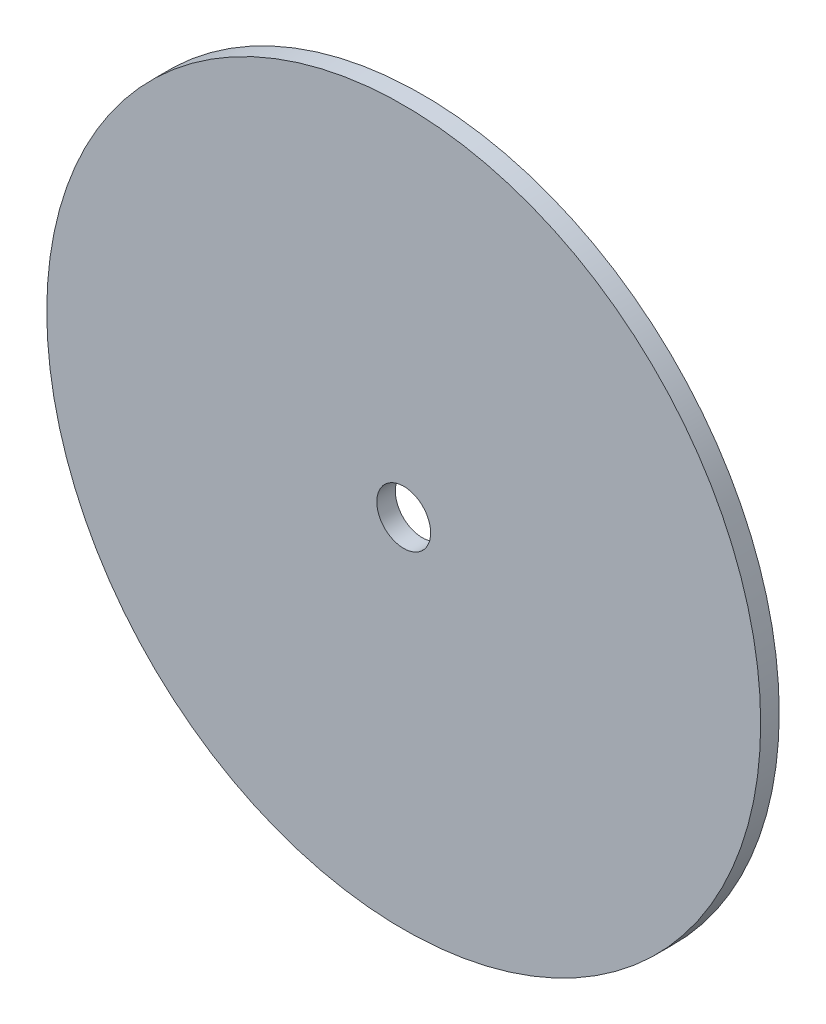
ISO-10303-21;
HEADER;
FILE_DESCRIPTION(('STEP AP214'),'2;1');
FILE_NAME('part.step','',(''),(''),'','','');
FILE_SCHEMA(('AUTOMOTIVE_DESIGN { 1 0 10303 214 1 1 1 1 }'));
ENDSEC;
DATA;
#1=APPLICATION_CONTEXT('core data for automotive mechanical design processes');
#2=APPLICATION_PROTOCOL_DEFINITION('international standard','automotive_design',2000,#1);
#3=PRODUCT_CONTEXT('',#1,'mechanical');
#4=PRODUCT('Part','Part','',(#3));
#5=PRODUCT_RELATED_PRODUCT_CATEGORY('part','',(#4));
#6=PRODUCT_DEFINITION_FORMATION('','',#4);
#7=PRODUCT_DEFINITION_CONTEXT('part definition',#1,'design');
#8=PRODUCT_DEFINITION('design','',#6,#7);
#9=PRODUCT_DEFINITION_SHAPE('','',#8);
#10=(LENGTH_UNIT() NAMED_UNIT(*) SI_UNIT(.MILLI.,.METRE.));
#11=(NAMED_UNIT(*) PLANE_ANGLE_UNIT() SI_UNIT($,.RADIAN.));
#12=(NAMED_UNIT(*) SI_UNIT($,.STERADIAN.) SOLID_ANGLE_UNIT());
#13=UNCERTAINTY_MEASURE_WITH_UNIT(LENGTH_MEASURE(1.E-05),#10,'distance_accuracy_value','');
#14=(GEOMETRIC_REPRESENTATION_CONTEXT(3) GLOBAL_UNCERTAINTY_ASSIGNED_CONTEXT((#13)) GLOBAL_UNIT_ASSIGNED_CONTEXT((#10,
#11,#12)) REPRESENTATION_CONTEXT('',''));
#15=CARTESIAN_POINT('',(0.,0.,0.));
#16=DIRECTION('',(0.,0.,1.));
#17=DIRECTION('',(1.,0.,0.));
#18=AXIS2_PLACEMENT_3D('',#15,#16,#17);
#19=CARTESIAN_POINT('',(0.,0.,1.55));
#20=DIRECTION('',(0.,0.,-1.));
#21=DIRECTION('',(-1.,0.,0.));
#22=AXIS2_PLACEMENT_3D('',#19,#20,#21);
#23=CYLINDRICAL_SURFACE('',#22,59.655);
#24=CARTESIAN_POINT('',(0.,0.,1.55));
#25=DIRECTION('',(0.,0.,1.));
#26=DIRECTION('',(1.,0.,0.));
#27=AXIS2_PLACEMENT_3D('',#24,#25,#26);
#28=CIRCLE('',#27,59.655);
#29=CARTESIAN_POINT('',(-59.655,0.,1.55));
#30=VERTEX_POINT('',#29);
#31=EDGE_CURVE('E10',#30,#30,#28,.T.);
#32=CARTESIAN_POINT('',(0.,0.,-1.55));
#33=DIRECTION('',(0.,0.,1.));
#34=DIRECTION('',(1.,0.,0.));
#35=AXIS2_PLACEMENT_3D('',#32,#33,#34);
#36=CIRCLE('',#35,59.655);
#37=CARTESIAN_POINT('',(-59.655,0.,-1.55));
#38=VERTEX_POINT('',#37);
#39=EDGE_CURVE('E42',#38,#38,#36,.T.);
#40=CARTESIAN_POINT('',(-59.655,0.,1.55));
#41=CARTESIAN_POINT('',(-59.655,0.,1.51770833333333));
#42=CARTESIAN_POINT('',(-59.655,0.,1.48541666666667));
#43=CARTESIAN_POINT('',(-59.655,0.,1.42083333333333));
#44=CARTESIAN_POINT('',(-59.655,0.,1.38854166666667));
#45=CARTESIAN_POINT('',(-59.655,0.,1.32395833333333));
#46=CARTESIAN_POINT('',(-59.655,0.,1.29166666666667));
#47=CARTESIAN_POINT('',(-59.655,0.,1.22708333333333));
#48=CARTESIAN_POINT('',(-59.655,0.,1.19479166666667));
#49=CARTESIAN_POINT('',(-59.655,0.,1.13020833333333));
#50=CARTESIAN_POINT('',(-59.655,0.,1.09791666666667));
#51=CARTESIAN_POINT('',(-59.655,0.,1.03333333333333));
#52=CARTESIAN_POINT('',(-59.655,0.,1.00104166666667));
#53=CARTESIAN_POINT('',(-59.655,0.,0.936458333333333));
#54=CARTESIAN_POINT('',(-59.655,0.,0.904166666666667));
#55=CARTESIAN_POINT('',(-59.655,0.,0.839583333333333));
#56=CARTESIAN_POINT('',(-59.655,0.,0.807291666666667));
#57=CARTESIAN_POINT('',(-59.655,0.,0.742708333333333));
#58=CARTESIAN_POINT('',(-59.655,0.,0.710416666666667));
#59=CARTESIAN_POINT('',(-59.655,0.,0.645833333333333));
#60=CARTESIAN_POINT('',(-59.655,0.,0.613541666666667));
#61=CARTESIAN_POINT('',(-59.655,0.,0.548958333333333));
#62=CARTESIAN_POINT('',(-59.655,0.,0.516666666666666));
#63=CARTESIAN_POINT('',(-59.655,0.,0.452083333333333));
#64=CARTESIAN_POINT('',(-59.655,0.,0.419791666666666));
#65=CARTESIAN_POINT('',(-59.655,0.,0.355208333333333));
#66=CARTESIAN_POINT('',(-59.655,0.,0.322916666666667));
#67=CARTESIAN_POINT('',(-59.655,0.,0.258333333333333));
#68=CARTESIAN_POINT('',(-59.655,0.,0.226041666666666));
#69=CARTESIAN_POINT('',(-59.655,0.,0.161458333333333));
#70=CARTESIAN_POINT('',(-59.655,0.,0.129166666666666));
#71=CARTESIAN_POINT('',(-59.655,0.,0.0645833333333331));
#72=CARTESIAN_POINT('',(-59.655,0.,0.0322916666666664));
#73=CARTESIAN_POINT('',(-59.655,0.,-0.0322916666666669));
#74=CARTESIAN_POINT('',(-59.655,0.,-0.0645833333333335));
#75=CARTESIAN_POINT('',(-59.655,0.,-0.129166666666667));
#76=CARTESIAN_POINT('',(-59.655,0.,-0.161458333333333));
#77=CARTESIAN_POINT('',(-59.655,0.,-0.226041666666667));
#78=CARTESIAN_POINT('',(-59.655,0.,-0.258333333333334));
#79=CARTESIAN_POINT('',(-59.655,0.,-0.322916666666667));
#80=CARTESIAN_POINT('',(-59.655,0.,-0.355208333333334));
#81=CARTESIAN_POINT('',(-59.655,0.,-0.419791666666667));
#82=CARTESIAN_POINT('',(-59.655,0.,-0.452083333333333));
#83=CARTESIAN_POINT('',(-59.655,0.,-0.516666666666666));
#84=CARTESIAN_POINT('',(-59.655,0.,-0.548958333333333));
#85=CARTESIAN_POINT('',(-59.655,0.,-0.613541666666667));
#86=CARTESIAN_POINT('',(-59.655,0.,-0.645833333333333));
#87=CARTESIAN_POINT('',(-59.655,0.,-0.710416666666666));
#88=CARTESIAN_POINT('',(-59.655,0.,-0.742708333333333));
#89=CARTESIAN_POINT('',(-59.655,0.,-0.807291666666667));
#90=CARTESIAN_POINT('',(-59.655,0.,-0.839583333333333));
#91=CARTESIAN_POINT('',(-59.655,0.,-0.904166666666667));
#92=CARTESIAN_POINT('',(-59.655,0.,-0.936458333333333));
#93=CARTESIAN_POINT('',(-59.655,0.,-1.00104166666667));
#94=CARTESIAN_POINT('',(-59.655,0.,-1.03333333333333));
#95=CARTESIAN_POINT('',(-59.655,0.,-1.09791666666667));
#96=CARTESIAN_POINT('',(-59.655,0.,-1.13020833333333));
#97=CARTESIAN_POINT('',(-59.655,0.,-1.19479166666667));
#98=CARTESIAN_POINT('',(-59.655,0.,-1.22708333333333));
#99=CARTESIAN_POINT('',(-59.655,0.,-1.29166666666667));
#100=CARTESIAN_POINT('',(-59.655,0.,-1.32395833333333));
#101=CARTESIAN_POINT('',(-59.655,0.,-1.38854166666667));
#102=CARTESIAN_POINT('',(-59.655,0.,-1.42083333333333));
#103=CARTESIAN_POINT('',(-59.655,0.,-1.48541666666667));
#104=CARTESIAN_POINT('',(-59.655,0.,-1.51770833333333));
#105=CARTESIAN_POINT('',(-59.655,0.,-1.55));
#106=B_SPLINE_CURVE_WITH_KNOTS('',3,(#40,#41,#42,#43,#44,#45,#46,#47,#48,#49,#50,#51,#52,#53,
#54,#55,#56,#57,#58,#59,#60,#61,#62,#63,#64,#65,#66,#67,#68,#69,#70,#71,#72,#73,#74,#75,#76,#77,
#78,#79,#80,#81,#82,#83,#84,#85,#86,#87,#88,#89,#90,#91,#92,#93,#94,#95,#96,#97,#98,#99,#100,
#101,#102,#103,#104,#105),.UNSPECIFIED.,.F.,.F.,(4,2,2,2,2,2,2,2,2,2,2,2,2,2,2,2,2,2,2,2,2,2,2,
2,2,2,2,2,2,2,2,2,4),(0.,0.096875,0.19375,0.290625,0.3875,0.484375,0.58125,0.678125,0.775,
0.871875,0.96875,1.065625,1.1625,1.259375,1.35625,1.453125,1.55,1.646875,1.74375,1.840625,
1.9375,2.034375,2.13125,2.228125,2.325,2.421875,2.51875,2.615625,2.7125,2.809375,2.90625,
3.003125,3.1),.UNSPECIFIED.);
#107=EDGE_CURVE('BSEAM41',#30,#38,#106,.T.);
#108=ORIENTED_EDGE('',*,*,#31,.F.);
#109=ORIENTED_EDGE('',*,*,#39,.T.);
#110=ORIENTED_EDGE('',*,*,#107,.T.);
#111=ORIENTED_EDGE('',*,*,#107,.F.);
#112=EDGE_LOOP('',(#108,#110,#109,#111));
#113=FACE_BOUND('',#112,.T.);
#114=ADVANCED_FACE('F41',(#113),#23,.T.);
#115=CARTESIAN_POINT('',(0.,0.,1.55));
#116=DIRECTION('',(0.,0.,1.));
#117=DIRECTION('',(1.,0.,0.));
#118=AXIS2_PLACEMENT_3D('',#115,#116,#117);
#119=PLANE('',#118);
#120=CARTESIAN_POINT('',(0.,0.,1.55));
#121=DIRECTION('',(0.,0.,1.));
#122=DIRECTION('',(1.,0.,0.));
#123=AXIS2_PLACEMENT_3D('',#120,#121,#122);
#124=CIRCLE('',#123,4.5);
#125=CARTESIAN_POINT('',(4.5,0.,1.55));
#126=VERTEX_POINT('',#125);
#127=EDGE_CURVE('E52',#126,#126,#124,.T.);
#128=ORIENTED_EDGE('',*,*,#127,.F.);
#129=EDGE_LOOP('',(#128));
#130=FACE_BOUND('',#129,.T.);
#131=ORIENTED_EDGE('',*,*,#31,.T.);
#132=EDGE_LOOP('',(#131));
#133=FACE_BOUND('',#132,.T.);
#134=ADVANCED_FACE('F67',(#130,#133),#119,.T.);
#135=CARTESIAN_POINT('',(0.,0.,-1.55));
#136=DIRECTION('',(0.,0.,1.));
#137=DIRECTION('',(1.,0.,0.));
#138=AXIS2_PLACEMENT_3D('',#135,#136,#137);
#139=PLANE('',#138);
#140=CARTESIAN_POINT('',(0.,0.,-1.55));
#141=DIRECTION('',(0.,0.,1.));
#142=DIRECTION('',(1.,0.,0.));
#143=AXIS2_PLACEMENT_3D('',#140,#141,#142);
#144=CIRCLE('',#143,4.5);
#145=CARTESIAN_POINT('',(4.5,0.,-1.55));
#146=VERTEX_POINT('',#145);
#147=EDGE_CURVE('E51',#146,#146,#144,.T.);
#148=ORIENTED_EDGE('',*,*,#147,.T.);
#149=EDGE_LOOP('',(#148));
#150=FACE_BOUND('',#149,.T.);
#151=ORIENTED_EDGE('',*,*,#39,.F.);
#152=EDGE_LOOP('',(#151));
#153=FACE_BOUND('',#152,.T.);
#154=ADVANCED_FACE('F56',(#150,#153),#139,.F.);
#155=CARTESIAN_POINT('',(0.,0.,-1.55));
#156=DIRECTION('',(0.,0.,1.));
#157=DIRECTION('',(1.,0.,0.));
#158=AXIS2_PLACEMENT_3D('',#155,#156,#157);
#159=CYLINDRICAL_SURFACE('',#158,4.5);
#160=CARTESIAN_POINT('',(4.5,0.,-1.55));
#161=CARTESIAN_POINT('',(4.5,0.,-1.51770833333333));
#162=CARTESIAN_POINT('',(4.5,0.,-1.48541666666667));
#163=CARTESIAN_POINT('',(4.5,0.,-1.42083333333333));
#164=CARTESIAN_POINT('',(4.5,0.,-1.38854166666667));
#165=CARTESIAN_POINT('',(4.5,0.,-1.32395833333333));
#166=CARTESIAN_POINT('',(4.5,0.,-1.29166666666667));
#167=CARTESIAN_POINT('',(4.5,0.,-1.22708333333333));
#168=CARTESIAN_POINT('',(4.5,0.,-1.19479166666667));
#169=CARTESIAN_POINT('',(4.5,0.,-1.13020833333333));
#170=CARTESIAN_POINT('',(4.5,0.,-1.09791666666667));
#171=CARTESIAN_POINT('',(4.5,0.,-1.03333333333333));
#172=CARTESIAN_POINT('',(4.5,0.,-1.00104166666667));
#173=CARTESIAN_POINT('',(4.5,0.,-0.936458333333333));
#174=CARTESIAN_POINT('',(4.5,0.,-0.904166666666667));
#175=CARTESIAN_POINT('',(4.5,0.,-0.839583333333333));
#176=CARTESIAN_POINT('',(4.5,0.,-0.807291666666667));
#177=CARTESIAN_POINT('',(4.5,0.,-0.742708333333333));
#178=CARTESIAN_POINT('',(4.5,0.,-0.710416666666667));
#179=CARTESIAN_POINT('',(4.5,0.,-0.645833333333333));
#180=CARTESIAN_POINT('',(4.5,0.,-0.613541666666667));
#181=CARTESIAN_POINT('',(4.5,0.,-0.548958333333333));
#182=CARTESIAN_POINT('',(4.5,0.,-0.516666666666667));
#183=CARTESIAN_POINT('',(4.5,0.,-0.452083333333333));
#184=CARTESIAN_POINT('',(4.5,0.,-0.419791666666667));
#185=CARTESIAN_POINT('',(4.5,0.,-0.355208333333333));
#186=CARTESIAN_POINT('',(4.5,0.,-0.322916666666667));
#187=CARTESIAN_POINT('',(4.5,0.,-0.258333333333333));
#188=CARTESIAN_POINT('',(4.5,0.,-0.226041666666667));
#189=CARTESIAN_POINT('',(4.5,0.,-0.161458333333333));
#190=CARTESIAN_POINT('',(4.5,0.,-0.129166666666667));
#191=CARTESIAN_POINT('',(4.5,0.,-0.0645833333333333));
#192=CARTESIAN_POINT('',(4.5,0.,-0.0322916666666667));
#193=CARTESIAN_POINT('',(4.5,0.,0.0322916666666667));
#194=CARTESIAN_POINT('',(4.5,0.,0.0645833333333333));
#195=CARTESIAN_POINT('',(4.5,0.,0.129166666666667));
#196=CARTESIAN_POINT('',(4.5,0.,0.161458333333333));
#197=CARTESIAN_POINT('',(4.5,0.,0.226041666666667));
#198=CARTESIAN_POINT('',(4.5,0.,0.258333333333333));
#199=CARTESIAN_POINT('',(4.5,0.,0.322916666666667));
#200=CARTESIAN_POINT('',(4.5,0.,0.355208333333333));
#201=CARTESIAN_POINT('',(4.5,0.,0.419791666666667));
#202=CARTESIAN_POINT('',(4.5,0.,0.452083333333333));
#203=CARTESIAN_POINT('',(4.5,0.,0.516666666666666));
#204=CARTESIAN_POINT('',(4.5,0.,0.548958333333333));
#205=CARTESIAN_POINT('',(4.5,0.,0.613541666666667));
#206=CARTESIAN_POINT('',(4.5,0.,0.645833333333333));
#207=CARTESIAN_POINT('',(4.5,0.,0.710416666666666));
#208=CARTESIAN_POINT('',(4.5,0.,0.742708333333333));
#209=CARTESIAN_POINT('',(4.5,0.,0.807291666666667));
#210=CARTESIAN_POINT('',(4.5,0.,0.839583333333333));
#211=CARTESIAN_POINT('',(4.5,0.,0.904166666666667));
#212=CARTESIAN_POINT('',(4.5,0.,0.936458333333333));
#213=CARTESIAN_POINT('',(4.5,0.,1.00104166666667));
#214=CARTESIAN_POINT('',(4.5,0.,1.03333333333333));
#215=CARTESIAN_POINT('',(4.5,0.,1.09791666666667));
#216=CARTESIAN_POINT('',(4.5,0.,1.13020833333333));
#217=CARTESIAN_POINT('',(4.5,0.,1.19479166666667));
#218=CARTESIAN_POINT('',(4.5,0.,1.22708333333333));
#219=CARTESIAN_POINT('',(4.5,0.,1.29166666666667));
#220=CARTESIAN_POINT('',(4.5,0.,1.32395833333333));
#221=CARTESIAN_POINT('',(4.5,0.,1.38854166666667));
#222=CARTESIAN_POINT('',(4.5,0.,1.42083333333333));
#223=CARTESIAN_POINT('',(4.5,0.,1.48541666666667));
#224=CARTESIAN_POINT('',(4.5,0.,1.51770833333333));
#225=CARTESIAN_POINT('',(4.5,0.,1.55));
#226=B_SPLINE_CURVE_WITH_KNOTS('',3,(#160,#161,#162,#163,#164,#165,#166,#167,#168,#169,#170,
#171,#172,#173,#174,#175,#176,#177,#178,#179,#180,#181,#182,#183,#184,#185,#186,#187,#188,#189,
#190,#191,#192,#193,#194,#195,#196,#197,#198,#199,#200,#201,#202,#203,#204,#205,#206,#207,#208,
#209,#210,#211,#212,#213,#214,#215,#216,#217,#218,#219,#220,#221,#222,#223,#224,#225),
.UNSPECIFIED.,.F.,.F.,(4,2,2,2,2,2,2,2,2,2,2,2,2,2,2,2,2,2,2,2,2,2,2,2,2,2,2,2,2,2,2,2,4),(0.,
0.096875,0.19375,0.290625,0.3875,0.484375,0.58125,0.678125,0.775,0.871875,0.96875,1.065625,
1.1625,1.259375,1.35625,1.453125,1.55,1.646875,1.74375,1.840625,1.9375,2.034375,2.13125,
2.228125,2.325,2.421875,2.51875,2.615625,2.7125,2.809375,2.90625,3.003125,3.1),.UNSPECIFIED.);
#227=EDGE_CURVE('BSEAM61',#146,#126,#226,.T.);
#228=ORIENTED_EDGE('',*,*,#147,.F.);
#229=ORIENTED_EDGE('',*,*,#127,.T.);
#230=ORIENTED_EDGE('',*,*,#227,.T.);
#231=ORIENTED_EDGE('',*,*,#227,.F.);
#232=EDGE_LOOP('',(#228,#230,#229,#231));
#233=FACE_BOUND('',#232,.T.);
#234=ADVANCED_FACE('F61',(#233),#159,.F.);
#235=CLOSED_SHELL('',(#114,#134,#154,#234));
#236=MANIFOLD_SOLID_BREP('B2',#235);
#237=ADVANCED_BREP_SHAPE_REPRESENTATION('',(#18,#236),#14);
#238=SHAPE_DEFINITION_REPRESENTATION(#9,#237);
ENDSEC;
END-ISO-10303-21;
